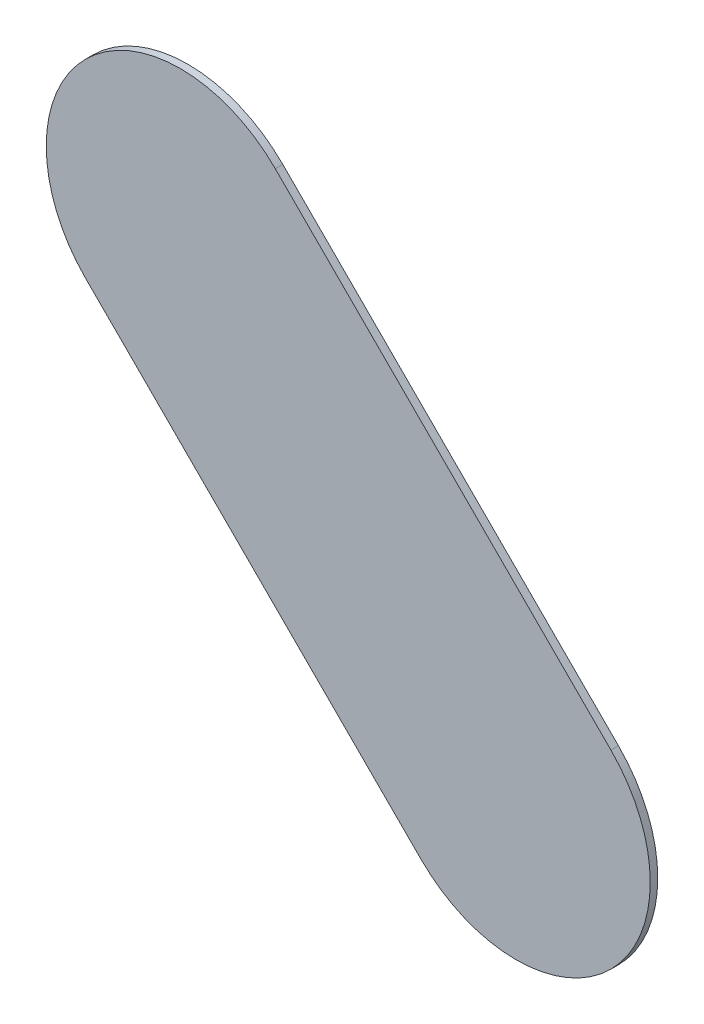
ISO-10303-21;
HEADER;
FILE_DESCRIPTION(('STEP AP214'),'2;1');
FILE_NAME('part.step','',(''),(''),'','','');
FILE_SCHEMA(('AUTOMOTIVE_DESIGN { 1 0 10303 214 1 1 1 1 }'));
ENDSEC;
DATA;
#1=APPLICATION_CONTEXT('core data for automotive mechanical design processes');
#2=APPLICATION_PROTOCOL_DEFINITION('international standard','automotive_design',2000,#1);
#3=PRODUCT_CONTEXT('',#1,'mechanical');
#4=PRODUCT('Part','Part','',(#3));
#5=PRODUCT_RELATED_PRODUCT_CATEGORY('part','',(#4));
#6=PRODUCT_DEFINITION_FORMATION('','',#4);
#7=PRODUCT_DEFINITION_CONTEXT('part definition',#1,'design');
#8=PRODUCT_DEFINITION('design','',#6,#7);
#9=PRODUCT_DEFINITION_SHAPE('','',#8);
#10=(LENGTH_UNIT() NAMED_UNIT(*) SI_UNIT(.MILLI.,.METRE.));
#11=(NAMED_UNIT(*) PLANE_ANGLE_UNIT() SI_UNIT($,.RADIAN.));
#12=(NAMED_UNIT(*) SI_UNIT($,.STERADIAN.) SOLID_ANGLE_UNIT());
#13=UNCERTAINTY_MEASURE_WITH_UNIT(LENGTH_MEASURE(1.E-05),#10,'distance_accuracy_value','');
#14=(GEOMETRIC_REPRESENTATION_CONTEXT(3) GLOBAL_UNCERTAINTY_ASSIGNED_CONTEXT((#13)) GLOBAL_UNIT_ASSIGNED_CONTEXT((#10,
#11,#12)) REPRESENTATION_CONTEXT('',''));
#15=CARTESIAN_POINT('',(0.,0.,0.));
#16=DIRECTION('',(0.,0.,1.));
#17=DIRECTION('',(1.,0.,0.));
#18=AXIS2_PLACEMENT_3D('',#15,#16,#17);
#19=CARTESIAN_POINT('',(113.105765,-117.894234,1.635));
#20=DIRECTION('',(0.,0.,1.));
#21=DIRECTION('',(1.,0.,0.));
#22=AXIS2_PLACEMENT_3D('',#19,#20,#21);
#23=PLANE('',#22);
#24=DIRECTION('',(-0.707106781186548,0.707106781186548,0.));
#25=VECTOR('',#24,1.);
#26=CARTESIAN_POINT('',(113.105765,-117.894234,1.635));
#27=LINE('',#26,#25);
#28=CARTESIAN_POINT('',(113.105765,-117.894234,1.635));
#29=VERTEX_POINT('',#28);
#30=CARTESIAN_POINT('',(111.541941,-116.33041,1.635));
#31=VERTEX_POINT('',#30);
#32=EDGE_CURVE('E82',#29,#31,#27,.T.);
#33=ORIENTED_EDGE('',*,*,#32,.T.);
#34=CARTESIAN_POINT('',(111.0999995,-116.7723515,1.635));
#35=DIRECTION('',(0.,0.,1.));
#36=DIRECTION('',(0.707106781186548,0.707106781186548,0.));
#37=AXIS2_PLACEMENT_3D('',#34,#35,#36);
#38=CIRCLE('',#37,0.624999663076);
#39=CARTESIAN_POINT('',(110.658058,-117.214293,1.635));
#40=VERTEX_POINT('',#39);
#41=EDGE_CURVE('E100',#31,#40,#38,.T.);
#42=ORIENTED_EDGE('',*,*,#41,.T.);
#43=DIRECTION('',(0.707106781186548,-0.707106781186548,0.));
#44=VECTOR('',#43,1.);
#45=CARTESIAN_POINT('',(110.658058,-117.214293,1.635));
#46=LINE('',#45,#44);
#47=CARTESIAN_POINT('',(112.221882,-118.778117,1.635));
#48=VERTEX_POINT('',#47);
#49=EDGE_CURVE('E74',#40,#48,#46,.T.);
#50=ORIENTED_EDGE('',*,*,#49,.T.);
#51=CARTESIAN_POINT('',(112.6638235,-118.3361755,1.635));
#52=DIRECTION('',(0.,0.,1.));
#53=DIRECTION('',(-0.707106781186548,-0.707106781186548,0.));
#54=AXIS2_PLACEMENT_3D('',#51,#52,#53);
#55=CIRCLE('',#54,0.624999663076);
#56=EDGE_CURVE('E11',#48,#29,#55,.T.);
#57=ORIENTED_EDGE('',*,*,#56,.T.);
#58=EDGE_LOOP('',(#33,#42,#50,#57));
#59=FACE_BOUND('',#58,.T.);
#60=ADVANCED_FACE('F17',(#59),#23,.T.);
#61=CARTESIAN_POINT('',(113.105765,-117.894234,1.6));
#62=DIRECTION('',(0.,0.,1.));
#63=DIRECTION('',(1.,0.,0.));
#64=AXIS2_PLACEMENT_3D('',#61,#62,#63);
#65=PLANE('',#64);
#66=CARTESIAN_POINT('',(112.6638235,-118.3361755,1.6));
#67=DIRECTION('',(0.,0.,1.));
#68=DIRECTION('',(-0.707106781186548,-0.707106781186548,0.));
#69=AXIS2_PLACEMENT_3D('',#66,#67,#68);
#70=CIRCLE('',#69,0.624999663076);
#71=CARTESIAN_POINT('',(112.221882,-118.778117,1.6));
#72=VERTEX_POINT('',#71);
#73=CARTESIAN_POINT('',(113.105765,-117.894234,1.6));
#74=VERTEX_POINT('',#73);
#75=EDGE_CURVE('E25',#72,#74,#70,.T.);
#76=ORIENTED_EDGE('',*,*,#75,.F.);
#77=DIRECTION('',(0.707106781186548,-0.707106781186548,0.));
#78=VECTOR('',#77,1.);
#79=CARTESIAN_POINT('',(110.658058,-117.214293,1.6));
#80=LINE('',#79,#78);
#81=CARTESIAN_POINT('',(110.658058,-117.214293,1.6));
#82=VERTEX_POINT('',#81);
#83=EDGE_CURVE('E103',#82,#72,#80,.T.);
#84=ORIENTED_EDGE('',*,*,#83,.F.);
#85=CARTESIAN_POINT('',(111.0999995,-116.7723515,1.6));
#86=DIRECTION('',(0.,0.,1.));
#87=DIRECTION('',(0.707106781186548,0.707106781186548,0.));
#88=AXIS2_PLACEMENT_3D('',#85,#86,#87);
#89=CIRCLE('',#88,0.624999663076);
#90=CARTESIAN_POINT('',(111.541941,-116.33041,1.6));
#91=VERTEX_POINT('',#90);
#92=EDGE_CURVE('E84',#91,#82,#89,.T.);
#93=ORIENTED_EDGE('',*,*,#92,.F.);
#94=DIRECTION('',(-0.707106781186548,0.707106781186548,0.));
#95=VECTOR('',#94,1.);
#96=CARTESIAN_POINT('',(113.105765,-117.894234,1.6));
#97=LINE('',#96,#95);
#98=EDGE_CURVE('E80',#74,#91,#97,.T.);
#99=ORIENTED_EDGE('',*,*,#98,.F.);
#100=EDGE_LOOP('',(#76,#84,#93,#99));
#101=FACE_BOUND('',#100,.T.);
#102=ADVANCED_FACE('F86',(#101),#65,.F.);
#103=CARTESIAN_POINT('',(112.6638235,-118.3361755,1.6));
#104=DIRECTION('',(0.,0.,-1.));
#105=DIRECTION('',(-0.707106781186548,-0.707106781186548,0.));
#106=AXIS2_PLACEMENT_3D('',#103,#104,#105);
#107=CYLINDRICAL_SURFACE('',#106,0.624999663076);
#108=ORIENTED_EDGE('',*,*,#75,.T.);
#109=DIRECTION('',(0.,0.,1.));
#110=VECTOR('',#109,1.);
#111=CARTESIAN_POINT('',(113.105765,-117.894234,1.6));
#112=LINE('',#111,#110);
#113=EDGE_CURVE('E68',#74,#29,#112,.T.);
#114=ORIENTED_EDGE('',*,*,#113,.T.);
#115=ORIENTED_EDGE('',*,*,#56,.F.);
#116=DIRECTION('',(0.,0.,1.));
#117=VECTOR('',#116,1.);
#118=CARTESIAN_POINT('',(112.221882,-118.778117,1.6));
#119=LINE('',#118,#117);
#120=EDGE_CURVE('E71',#72,#48,#119,.T.);
#121=ORIENTED_EDGE('',*,*,#120,.F.);
#122=EDGE_LOOP('',(#108,#114,#115,#121));
#123=FACE_BOUND('',#122,.T.);
#124=ADVANCED_FACE('F67',(#123),#107,.T.);
#125=CARTESIAN_POINT('',(110.658058,-117.214293,1.6));
#126=DIRECTION('',(0.707106781186548,0.707106781186548,0.));
#127=DIRECTION('',(0.,0.,-1.));
#128=AXIS2_PLACEMENT_3D('',#125,#126,#127);
#129=PLANE('',#128);
#130=ORIENTED_EDGE('',*,*,#83,.T.);
#131=ORIENTED_EDGE('',*,*,#120,.T.);
#132=ORIENTED_EDGE('',*,*,#49,.F.);
#133=DIRECTION('',(0.,0.,1.));
#134=VECTOR('',#133,1.);
#135=CARTESIAN_POINT('',(110.658058,-117.214293,1.6));
#136=LINE('',#135,#134);
#137=EDGE_CURVE('E99',#82,#40,#136,.T.);
#138=ORIENTED_EDGE('',*,*,#137,.F.);
#139=EDGE_LOOP('',(#130,#131,#132,#138));
#140=FACE_BOUND('',#139,.T.);
#141=ADVANCED_FACE('F116',(#140),#129,.F.);
#142=CARTESIAN_POINT('',(111.0999995,-116.7723515,1.6));
#143=DIRECTION('',(0.,0.,-1.));
#144=DIRECTION('',(0.707106781186548,0.707106781186548,0.));
#145=AXIS2_PLACEMENT_3D('',#142,#143,#144);
#146=CYLINDRICAL_SURFACE('',#145,0.624999663076);
#147=ORIENTED_EDGE('',*,*,#92,.T.);
#148=ORIENTED_EDGE('',*,*,#137,.T.);
#149=ORIENTED_EDGE('',*,*,#41,.F.);
#150=DIRECTION('',(0.,0.,1.));
#151=VECTOR('',#150,1.);
#152=CARTESIAN_POINT('',(111.541941,-116.33041,1.6));
#153=LINE('',#152,#151);
#154=EDGE_CURVE('E90',#91,#31,#153,.T.);
#155=ORIENTED_EDGE('',*,*,#154,.F.);
#156=EDGE_LOOP('',(#147,#148,#149,#155));
#157=FACE_BOUND('',#156,.T.);
#158=ADVANCED_FACE('F121',(#157),#146,.T.);
#159=CARTESIAN_POINT('',(113.105765,-117.894234,1.6));
#160=DIRECTION('',(-0.707106781186548,-0.707106781186548,0.));
#161=DIRECTION('',(-0.707106781186548,0.707106781186548,0.));
#162=AXIS2_PLACEMENT_3D('',#159,#160,#161);
#163=PLANE('',#162);
#164=ORIENTED_EDGE('',*,*,#98,.T.);
#165=ORIENTED_EDGE('',*,*,#154,.T.);
#166=ORIENTED_EDGE('',*,*,#32,.F.);
#167=ORIENTED_EDGE('',*,*,#113,.F.);
#168=EDGE_LOOP('',(#164,#165,#166,#167));
#169=FACE_BOUND('',#168,.T.);
#170=ADVANCED_FACE('F78',(#169),#163,.F.);
#171=CLOSED_SHELL('',(#60,#102,#124,#141,#158,#170));
#172=MANIFOLD_SOLID_BREP('B1',#171);
#173=ADVANCED_BREP_SHAPE_REPRESENTATION('',(#18,#172),#14);
#174=SHAPE_DEFINITION_REPRESENTATION(#9,#173);
ENDSEC;
END-ISO-10303-21;
